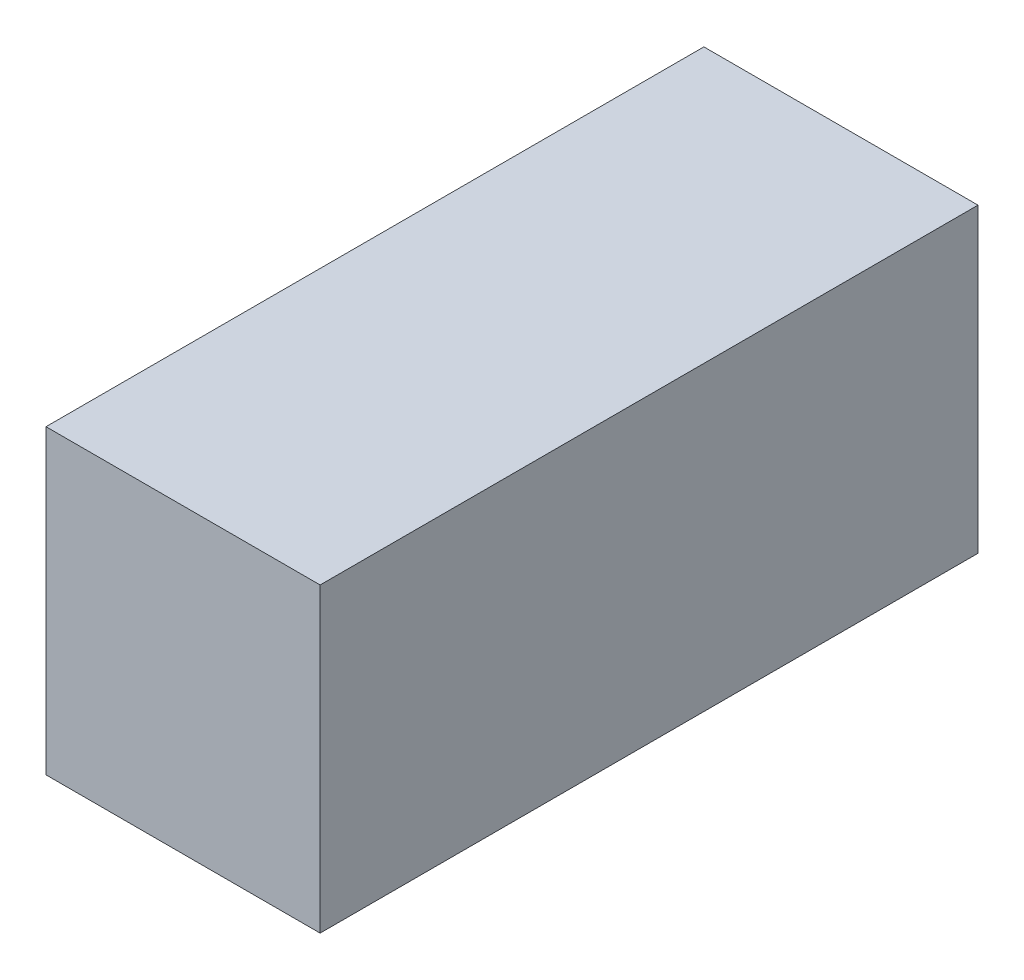
ISO-10303-21;
HEADER;
FILE_DESCRIPTION(('STEP AP214'),'2;1');
FILE_NAME('part.step','',(''),(''),'','','');
FILE_SCHEMA(('AUTOMOTIVE_DESIGN { 1 0 10303 214 1 1 1 1 }'));
ENDSEC;
DATA;
#1=APPLICATION_CONTEXT('core data for automotive mechanical design processes');
#2=APPLICATION_PROTOCOL_DEFINITION('international standard','automotive_design',2000,#1);
#3=PRODUCT_CONTEXT('',#1,'mechanical');
#4=PRODUCT('Part','Part','',(#3));
#5=PRODUCT_RELATED_PRODUCT_CATEGORY('part','',(#4));
#6=PRODUCT_DEFINITION_FORMATION('','',#4);
#7=PRODUCT_DEFINITION_CONTEXT('part definition',#1,'design');
#8=PRODUCT_DEFINITION('design','',#6,#7);
#9=PRODUCT_DEFINITION_SHAPE('','',#8);
#10=(LENGTH_UNIT() NAMED_UNIT(*) SI_UNIT(.MILLI.,.METRE.));
#11=(NAMED_UNIT(*) PLANE_ANGLE_UNIT() SI_UNIT($,.RADIAN.));
#12=(NAMED_UNIT(*) SI_UNIT($,.STERADIAN.) SOLID_ANGLE_UNIT());
#13=UNCERTAINTY_MEASURE_WITH_UNIT(LENGTH_MEASURE(1.E-05),#10,'distance_accuracy_value','');
#14=(GEOMETRIC_REPRESENTATION_CONTEXT(3) GLOBAL_UNCERTAINTY_ASSIGNED_CONTEXT((#13)) GLOBAL_UNIT_ASSIGNED_CONTEXT((#10,
#11,#12)) REPRESENTATION_CONTEXT('',''));
#15=CARTESIAN_POINT('',(0.,0.,0.));
#16=DIRECTION('',(0.,0.,1.));
#17=DIRECTION('',(1.,0.,0.));
#18=AXIS2_PLACEMENT_3D('',#15,#16,#17);
#19=CARTESIAN_POINT('',(-15.875,34.925,-38.1));
#20=DIRECTION('',(1.,0.,0.));
#21=DIRECTION('',(0.,0.,-1.));
#22=AXIS2_PLACEMENT_3D('',#19,#20,#21);
#23=PLANE('',#22);
#24=DIRECTION('',(0.,0.,1.));
#25=VECTOR('',#24,1.);
#26=CARTESIAN_POINT('',(-15.875,0.,-38.1));
#27=LINE('',#26,#25);
#28=CARTESIAN_POINT('',(-15.875,0.,-38.1));
#29=VERTEX_POINT('',#28);
#30=CARTESIAN_POINT('',(-15.875,0.,38.1));
#31=VERTEX_POINT('',#30);
#32=EDGE_CURVE('E99',#29,#31,#27,.T.);
#33=ORIENTED_EDGE('',*,*,#32,.T.);
#34=DIRECTION('',(0.,-1.,0.));
#35=VECTOR('',#34,1.);
#36=CARTESIAN_POINT('',(-15.875,34.925,38.1));
#37=LINE('',#36,#35);
#38=CARTESIAN_POINT('',(-15.875,34.925,38.1));
#39=VERTEX_POINT('',#38);
#40=EDGE_CURVE('E11',#39,#31,#37,.T.);
#41=ORIENTED_EDGE('',*,*,#40,.F.);
#42=DIRECTION('',(0.,0.,1.));
#43=VECTOR('',#42,1.);
#44=CARTESIAN_POINT('',(-15.875,34.925,-38.1));
#45=LINE('',#44,#43);
#46=CARTESIAN_POINT('',(-15.875,34.925,-38.1));
#47=VERTEX_POINT('',#46);
#48=EDGE_CURVE('E87',#47,#39,#45,.T.);
#49=ORIENTED_EDGE('',*,*,#48,.F.);
#50=DIRECTION('',(0.,-1.,0.));
#51=VECTOR('',#50,1.);
#52=CARTESIAN_POINT('',(-15.875,34.925,-38.1));
#53=LINE('',#52,#51);
#54=EDGE_CURVE('E95',#47,#29,#53,.T.);
#55=ORIENTED_EDGE('',*,*,#54,.T.);
#56=EDGE_LOOP('',(#33,#41,#49,#55));
#57=FACE_BOUND('',#56,.T.);
#58=ADVANCED_FACE('F36',(#57),#23,.F.);
#59=CARTESIAN_POINT('',(-15.875,34.925,38.1));
#60=DIRECTION('',(0.,0.,-1.));
#61=DIRECTION('',(-1.,0.,0.));
#62=AXIS2_PLACEMENT_3D('',#59,#60,#61);
#63=PLANE('',#62);
#64=DIRECTION('',(1.,0.,0.));
#65=VECTOR('',#64,1.);
#66=CARTESIAN_POINT('',(-15.875,0.,38.1));
#67=LINE('',#66,#65);
#68=CARTESIAN_POINT('',(15.875,0.,38.1));
#69=VERTEX_POINT('',#68);
#70=EDGE_CURVE('E91',#31,#69,#67,.T.);
#71=ORIENTED_EDGE('',*,*,#70,.T.);
#72=DIRECTION('',(0.,-1.,0.));
#73=VECTOR('',#72,1.);
#74=CARTESIAN_POINT('',(15.875,34.925,38.1));
#75=LINE('',#74,#73);
#76=CARTESIAN_POINT('',(15.875,34.925,38.1));
#77=VERTEX_POINT('',#76);
#78=EDGE_CURVE('E44',#77,#69,#75,.T.);
#79=ORIENTED_EDGE('',*,*,#78,.F.);
#80=DIRECTION('',(1.,0.,0.));
#81=VECTOR('',#80,1.);
#82=CARTESIAN_POINT('',(-15.875,34.925,38.1));
#83=LINE('',#82,#81);
#84=EDGE_CURVE('E82',#39,#77,#83,.T.);
#85=ORIENTED_EDGE('',*,*,#84,.F.);
#86=ORIENTED_EDGE('',*,*,#40,.T.);
#87=EDGE_LOOP('',(#71,#79,#85,#86));
#88=FACE_BOUND('',#87,.T.);
#89=ADVANCED_FACE('F90',(#88),#63,.F.);
#90=CARTESIAN_POINT('',(15.875,34.925,-38.1));
#91=DIRECTION('',(-1.,0.,0.));
#92=DIRECTION('',(0.,0.,1.));
#93=AXIS2_PLACEMENT_3D('',#90,#91,#92);
#94=PLANE('',#93);
#95=DIRECTION('',(0.,0.,-1.));
#96=VECTOR('',#95,1.);
#97=CARTESIAN_POINT('',(15.875,0.,-38.1));
#98=LINE('',#97,#96);
#99=CARTESIAN_POINT('',(15.875,0.,-38.1));
#100=VERTEX_POINT('',#99);
#101=EDGE_CURVE('E69',#69,#100,#98,.T.);
#102=ORIENTED_EDGE('',*,*,#101,.T.);
#103=DIRECTION('',(0.,-1.,0.));
#104=VECTOR('',#103,1.);
#105=CARTESIAN_POINT('',(15.875,34.925,-38.1));
#106=LINE('',#105,#104);
#107=CARTESIAN_POINT('',(15.875,34.925,-38.1));
#108=VERTEX_POINT('',#107);
#109=EDGE_CURVE('E92',#108,#100,#106,.T.);
#110=ORIENTED_EDGE('',*,*,#109,.F.);
#111=DIRECTION('',(0.,0.,-1.));
#112=VECTOR('',#111,1.);
#113=CARTESIAN_POINT('',(15.875,34.925,-38.1));
#114=LINE('',#113,#112);
#115=EDGE_CURVE('E85',#77,#108,#114,.T.);
#116=ORIENTED_EDGE('',*,*,#115,.F.);
#117=ORIENTED_EDGE('',*,*,#78,.T.);
#118=EDGE_LOOP('',(#102,#110,#116,#117));
#119=FACE_BOUND('',#118,.T.);
#120=ADVANCED_FACE('F93',(#119),#94,.F.);
#121=CARTESIAN_POINT('',(-15.875,34.925,-38.1));
#122=DIRECTION('',(0.,0.,1.));
#123=DIRECTION('',(1.,0.,0.));
#124=AXIS2_PLACEMENT_3D('',#121,#122,#123);
#125=PLANE('',#124);
#126=DIRECTION('',(-1.,0.,0.));
#127=VECTOR('',#126,1.);
#128=CARTESIAN_POINT('',(-15.875,0.,-38.1));
#129=LINE('',#128,#127);
#130=EDGE_CURVE('E75',#100,#29,#129,.T.);
#131=ORIENTED_EDGE('',*,*,#130,.T.);
#132=ORIENTED_EDGE('',*,*,#54,.F.);
#133=DIRECTION('',(-1.,0.,0.));
#134=VECTOR('',#133,1.);
#135=CARTESIAN_POINT('',(-15.875,34.925,-38.1));
#136=LINE('',#135,#134);
#137=EDGE_CURVE('E52',#108,#47,#136,.T.);
#138=ORIENTED_EDGE('',*,*,#137,.F.);
#139=ORIENTED_EDGE('',*,*,#109,.T.);
#140=EDGE_LOOP('',(#131,#132,#138,#139));
#141=FACE_BOUND('',#140,.T.);
#142=ADVANCED_FACE('F106',(#141),#125,.F.);
#143=CARTESIAN_POINT('',(0.,34.925,0.));
#144=DIRECTION('',(0.,1.,0.));
#145=DIRECTION('',(0.,0.,1.));
#146=AXIS2_PLACEMENT_3D('',#143,#144,#145);
#147=PLANE('',#146);
#148=ORIENTED_EDGE('',*,*,#48,.T.);
#149=ORIENTED_EDGE('',*,*,#84,.T.);
#150=ORIENTED_EDGE('',*,*,#115,.T.);
#151=ORIENTED_EDGE('',*,*,#137,.T.);
#152=EDGE_LOOP('',(#148,#149,#150,#151));
#153=FACE_BOUND('',#152,.T.);
#154=ADVANCED_FACE('F83',(#153),#147,.T.);
#155=CARTESIAN_POINT('',(0.,0.,0.));
#156=DIRECTION('',(0.,1.,0.));
#157=DIRECTION('',(0.,0.,1.));
#158=AXIS2_PLACEMENT_3D('',#155,#156,#157);
#159=PLANE('',#158);
#160=ORIENTED_EDGE('',*,*,#32,.F.);
#161=ORIENTED_EDGE('',*,*,#130,.F.);
#162=ORIENTED_EDGE('',*,*,#101,.F.);
#163=ORIENTED_EDGE('',*,*,#70,.F.);
#164=EDGE_LOOP('',(#160,#161,#162,#163));
#165=FACE_BOUND('',#164,.T.);
#166=ADVANCED_FACE('F109',(#165),#159,.F.);
#167=CLOSED_SHELL('',(#58,#89,#120,#142,#154,#166));
#168=MANIFOLD_SOLID_BREP('B2',#167);
#169=ADVANCED_BREP_SHAPE_REPRESENTATION('',(#18,#168),#14);
#170=SHAPE_DEFINITION_REPRESENTATION(#9,#169);
ENDSEC;
END-ISO-10303-21;
